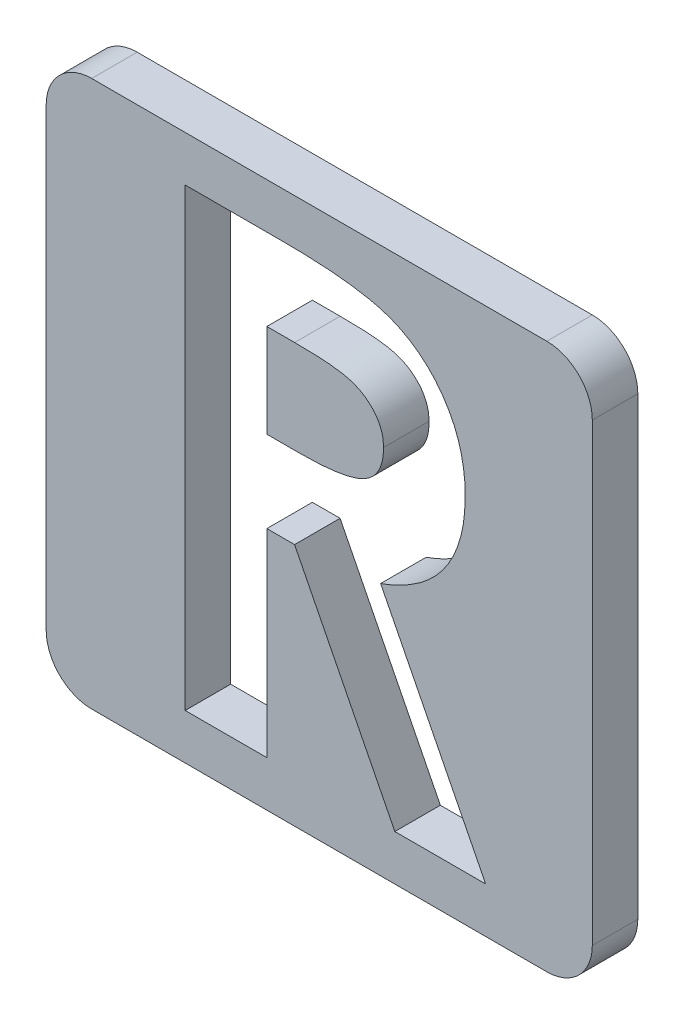
ISO-10303-21;
HEADER;
FILE_DESCRIPTION(('STEP AP214'),'2;1');
FILE_NAME('part.step','',(''),(''),'','','');
FILE_SCHEMA(('AUTOMOTIVE_DESIGN { 1 0 10303 214 1 1 1 1 }'));
ENDSEC;
DATA;
#1=APPLICATION_CONTEXT('core data for automotive mechanical design processes');
#2=APPLICATION_PROTOCOL_DEFINITION('international standard','automotive_design',2000,#1);
#3=PRODUCT_CONTEXT('',#1,'mechanical');
#4=PRODUCT('Part','Part','',(#3));
#5=PRODUCT_RELATED_PRODUCT_CATEGORY('part','',(#4));
#6=PRODUCT_DEFINITION_FORMATION('','',#4);
#7=PRODUCT_DEFINITION_CONTEXT('part definition',#1,'design');
#8=PRODUCT_DEFINITION('design','',#6,#7);
#9=PRODUCT_DEFINITION_SHAPE('','',#8);
#10=(LENGTH_UNIT() NAMED_UNIT(*) SI_UNIT(.MILLI.,.METRE.));
#11=(NAMED_UNIT(*) PLANE_ANGLE_UNIT() SI_UNIT($,.RADIAN.));
#12=(NAMED_UNIT(*) SI_UNIT($,.STERADIAN.) SOLID_ANGLE_UNIT());
#13=UNCERTAINTY_MEASURE_WITH_UNIT(LENGTH_MEASURE(1.E-05),#10,'distance_accuracy_value','');
#14=(GEOMETRIC_REPRESENTATION_CONTEXT(3) GLOBAL_UNCERTAINTY_ASSIGNED_CONTEXT((#13)) GLOBAL_UNIT_ASSIGNED_CONTEXT((#10,
#11,#12)) REPRESENTATION_CONTEXT('',''));
#15=CARTESIAN_POINT('',(0.,0.,0.));
#16=DIRECTION('',(0.,0.,1.));
#17=DIRECTION('',(1.,0.,0.));
#18=AXIS2_PLACEMENT_3D('',#15,#16,#17);
#19=CARTESIAN_POINT('',(50.,50.,10.));
#20=DIRECTION('',(0.,0.,-1.));
#21=DIRECTION('',(-1.,0.,0.));
#22=AXIS2_PLACEMENT_3D('',#19,#20,#21);
#23=PLANE('',#22);
#24=DIRECTION('',(1.,0.,0.));
#25=VECTOR('',#24,1.);
#26=CARTESIAN_POINT('',(-49.9999999999999,60.,10.));
#27=LINE('',#26,#25);
#28=CARTESIAN_POINT('',(-49.9999999999999,60.,10.));
#29=VERTEX_POINT('',#28);
#30=CARTESIAN_POINT('',(49.9999999999999,60.,10.));
#31=VERTEX_POINT('',#30);
#32=EDGE_CURVE('E288',#29,#31,#27,.T.);
#33=ORIENTED_EDGE('',*,*,#32,.F.);
#34=CARTESIAN_POINT('',(-50.,50.,10.));
#35=DIRECTION('',(0.,0.,1.));
#36=DIRECTION('',(1.,0.,0.));
#37=AXIS2_PLACEMENT_3D('',#34,#35,#36);
#38=CIRCLE('',#37,10.);
#39=CARTESIAN_POINT('',(-60.,49.9999999999999,10.));
#40=VERTEX_POINT('',#39);
#41=EDGE_CURVE('E377',#29,#40,#38,.T.);
#42=ORIENTED_EDGE('',*,*,#41,.T.);
#43=DIRECTION('',(0.,-1.,0.));
#44=VECTOR('',#43,1.);
#45=CARTESIAN_POINT('',(-60.,49.9999999999999,10.));
#46=LINE('',#45,#44);
#47=CARTESIAN_POINT('',(-60.,-49.9999999999999,10.));
#48=VERTEX_POINT('',#47);
#49=EDGE_CURVE('E379',#40,#48,#46,.T.);
#50=ORIENTED_EDGE('',*,*,#49,.T.);
#51=CARTESIAN_POINT('',(-50.,-50.,10.));
#52=DIRECTION('',(0.,0.,1.));
#53=DIRECTION('',(1.,0.,0.));
#54=AXIS2_PLACEMENT_3D('',#51,#52,#53);
#55=CIRCLE('',#54,10.);
#56=CARTESIAN_POINT('',(-49.9999999999999,-60.,10.));
#57=VERTEX_POINT('',#56);
#58=EDGE_CURVE('E381',#48,#57,#55,.T.);
#59=ORIENTED_EDGE('',*,*,#58,.T.);
#60=DIRECTION('',(1.,0.,0.));
#61=VECTOR('',#60,1.);
#62=CARTESIAN_POINT('',(-49.9999999999999,-60.,10.));
#63=LINE('',#62,#61);
#64=CARTESIAN_POINT('',(49.9999999999999,-60.,10.));
#65=VERTEX_POINT('',#64);
#66=EDGE_CURVE('E383',#57,#65,#63,.T.);
#67=ORIENTED_EDGE('',*,*,#66,.T.);
#68=CARTESIAN_POINT('',(50.,-50.,10.));
#69=DIRECTION('',(0.,0.,1.));
#70=DIRECTION('',(1.,0.,0.));
#71=AXIS2_PLACEMENT_3D('',#68,#69,#70);
#72=CIRCLE('',#71,10.);
#73=CARTESIAN_POINT('',(60.,-50.,10.));
#74=VERTEX_POINT('',#73);
#75=EDGE_CURVE('E209',#65,#74,#72,.T.);
#76=ORIENTED_EDGE('',*,*,#75,.T.);
#77=DIRECTION('',(0.,-1.,0.));
#78=VECTOR('',#77,1.);
#79=CARTESIAN_POINT('',(60.,49.9999999999999,10.));
#80=LINE('',#79,#78);
#81=CARTESIAN_POINT('',(60.,49.9999999999999,10.));
#82=VERTEX_POINT('',#81);
#83=EDGE_CURVE('E386',#82,#74,#80,.T.);
#84=ORIENTED_EDGE('',*,*,#83,.F.);
#85=CARTESIAN_POINT('',(50.,50.,10.));
#86=DIRECTION('',(0.,0.,-1.));
#87=DIRECTION('',(-1.,0.,0.));
#88=AXIS2_PLACEMENT_3D('',#85,#86,#87);
#89=CIRCLE('',#88,10.);
#90=EDGE_CURVE('E388',#31,#82,#89,.T.);
#91=ORIENTED_EDGE('',*,*,#90,.F.);
#92=EDGE_LOOP('',(#33,#42,#50,#59,#67,#76,#84,#91));
#93=FACE_BOUND('',#92,.T.);
#94=DIRECTION('',(0.,1.,0.));
#95=VECTOR('',#94,1.);
#96=CARTESIAN_POINT('',(-29.4615384615385,-50.,10.));
#97=LINE('',#96,#95);
#98=CARTESIAN_POINT('',(-29.4615384615385,-50.,10.));
#99=VERTEX_POINT('',#98);
#100=CARTESIAN_POINT('',(-29.4615384615385,50.,10.));
#101=VERTEX_POINT('',#100);
#102=EDGE_CURVE('E111',#99,#101,#97,.T.);
#103=ORIENTED_EDGE('',*,*,#102,.T.);
#104=DIRECTION('',(1.,0.,0.));
#105=VECTOR('',#104,1.);
#106=CARTESIAN_POINT('',(-29.4615384615385,50.,10.));
#107=LINE('',#106,#105);
#108=CARTESIAN_POINT('',(-8.54807692307692,50.,10.));
#109=VERTEX_POINT('',#108);
#110=EDGE_CURVE('E101',#101,#109,#107,.T.);
#111=ORIENTED_EDGE('',*,*,#110,.T.);
#112=CARTESIAN_POINT('',(-8.54807692307692,50.,10.));
#113=CARTESIAN_POINT('',(-7.16570348136394,49.9950933676502,10.));
#114=CARTESIAN_POINT('',(-4.507009958922,49.9856565315163,10.));
#115=CARTESIAN_POINT('',(-0.673319114981953,49.836768254122,10.));
#116=CARTESIAN_POINT('',(2.84845314370072,49.6295779958576,10.));
#117=CARTESIAN_POINT('',(6.06352111950216,49.3134001625521,10.));
#118=CARTESIAN_POINT('',(8.97050935335562,48.8941865741159,10.));
#119=CARTESIAN_POINT('',(11.5723313269203,48.4000031240224,10.));
#120=CARTESIAN_POINT('',(13.8689109915062,47.8367751326788,10.));
#121=CARTESIAN_POINT('',(15.8796168248235,47.1349486181643,10.));
#122=CARTESIAN_POINT('',(17.6941794119808,46.3432989500912,10.));
#123=CARTESIAN_POINT('',(19.3856040157519,45.4336789652992,10.));
#124=CARTESIAN_POINT('',(20.9912059781231,44.4162175699911,10.));
#125=CARTESIAN_POINT('',(22.5002535840768,43.2641426007948,10.));
#126=CARTESIAN_POINT('',(23.9258608121027,41.9981796025808,10.));
#127=CARTESIAN_POINT('',(25.2707171557078,40.6170542592858,10.));
#128=CARTESIAN_POINT('',(26.5158185482425,39.10905519684,10.));
#129=CARTESIAN_POINT('',(27.6534552713426,37.4837110556326,10.));
#130=CARTESIAN_POINT('',(28.6903195706035,35.7738862904611,10.));
#131=CARTESIAN_POINT('',(29.6066901433412,33.9772333007643,10.));
#132=CARTESIAN_POINT('',(30.3518842161974,32.0925026340516,10.));
#133=CARTESIAN_POINT('',(31.0103430625997,30.1469327231469,10.));
#134=CARTESIAN_POINT('',(31.4846096378619,28.112711264479,10.));
#135=CARTESIAN_POINT('',(31.8144551030385,26.0096417473334,10.));
#136=CARTESIAN_POINT('',(32.0559550490669,23.8303211437208,10.));
#137=CARTESIAN_POINT('',(32.0698401414022,22.3497874863529,10.));
#138=CARTESIAN_POINT('',(32.0769230769231,21.5945512820513,10.));
#139=B_SPLINE_CURVE_WITH_KNOTS('',3,(#112,#113,#114,#115,#116,#117,#118,#119,#120,#121,#122,
#123,#124,#125,#126,#127,#128,#129,#130,#131,#132,#133,#134,#135,#136,#137,#138),.UNSPECIFIED.,
.F.,.F.,(4,1,1,1,1,1,1,1,1,1,1,1,1,1,1,1,1,1,1,1,1,1,1,1,4),(0.,0.0728890266200383,
0.140186129944494,0.202277434124959,0.258895131751463,0.310482942465478,0.357095244131335,
0.398513566653466,0.435037510870116,0.469251485829287,0.502805027890275,0.536210446318562,
0.569379359939206,0.602801475048393,0.636665798336777,0.670928656894043,0.705803000229313,
0.741189061245877,0.776304311076462,0.812004300912935,0.847968975808895,0.884521761196479,
0.921974158544205,0.960198175809608,1.),.UNSPECIFIED.);
#140=CARTESIAN_POINT('',(32.0769230769231,21.5945512820513,10.));
#141=VERTEX_POINT('',#140);
#142=EDGE_CURVE('E180',#109,#141,#139,.T.);
#143=ORIENTED_EDGE('',*,*,#142,.T.);
#144=CARTESIAN_POINT('',(32.0769230769231,21.5945512820513,10.));
#145=CARTESIAN_POINT('',(32.0585241575579,20.8062581795036,10.));
#146=CARTESIAN_POINT('',(32.0224472300487,19.2605590788025,10.));
#147=CARTESIAN_POINT('',(31.828117271832,16.9900531664223,10.));
#148=CARTESIAN_POINT('',(31.4729431533373,14.8177919244886,10.));
#149=CARTESIAN_POINT('',(30.934980279809,12.7501354666698,10.));
#150=CARTESIAN_POINT('',(30.316661831982,10.7613493978477,10.));
#151=CARTESIAN_POINT('',(29.4944569039569,8.88812806461248,10.));
#152=CARTESIAN_POINT('',(28.5665173787216,7.1032281764701,10.));
#153=CARTESIAN_POINT('',(27.4644307161339,5.43189781885025,10.));
#154=CARTESIAN_POINT('',(26.2549444445558,3.83701340535703,10.));
#155=CARTESIAN_POINT('',(24.8483373529539,2.37968087459511,10.));
#156=CARTESIAN_POINT('',(23.3357359747616,0.981574121063749,10.));
#157=CARTESIAN_POINT('',(21.6321114777145,-0.269734191523331,10.));
#158=CARTESIAN_POINT('',(19.8125612121984,-1.45885300961546,10.));
#159=CARTESIAN_POINT('',(17.8409326288097,-2.53651133321237,10.));
#160=CARTESIAN_POINT('',(15.7300932518639,-3.52979901121726,10.));
#161=CARTESIAN_POINT('',(14.2460686345266,-4.08372483334129,10.));
#162=CARTESIAN_POINT('',(13.4871794871795,-4.36698717948719,10.));
#163=B_SPLINE_CURVE_WITH_KNOTS('',3,(#144,#145,#146,#147,#148,#149,#150,#151,#152,#153,#154,
#155,#156,#157,#158,#159,#160,#161,#162),.UNSPECIFIED.,.F.,.F.,(4,1,1,1,1,1,1,1,1,1,1,1,1,1,1,1,
4),(0.,0.0687412630793655,0.134789088195034,0.198536049560691,0.260385650605921,
0.320961578232197,0.379903849584149,0.438502935775268,0.496154343976269,0.554265483208499,
0.612748760815695,0.672513442526179,0.733646401897974,0.796789619481454,0.861935699041025,
0.929397734774898,1.),.UNSPECIFIED.);
#164=CARTESIAN_POINT('',(13.4871794871795,-4.36698717948719,10.));
#165=VERTEX_POINT('',#164);
#166=EDGE_CURVE('E188',#141,#165,#163,.T.);
#167=ORIENTED_EDGE('',*,*,#166,.T.);
#168=DIRECTION('',(0.451283039143577,-0.892380870806483,0.));
#169=VECTOR('',#168,1.);
#170=CARTESIAN_POINT('',(13.4871794871795,-4.36698717948719,10.));
#171=LINE('',#170,#169);
#172=CARTESIAN_POINT('',(36.5641025641026,-50.,10.));
#173=VERTEX_POINT('',#172);
#174=EDGE_CURVE('E195',#165,#173,#171,.T.);
#175=ORIENTED_EDGE('',*,*,#174,.T.);
#176=DIRECTION('',(-1.,0.,0.));
#177=VECTOR('',#176,1.);
#178=CARTESIAN_POINT('',(36.5641025641026,-50.,10.));
#179=LINE('',#178,#177);
#180=CARTESIAN_POINT('',(16.6121794871795,-50.,10.));
#181=VERTEX_POINT('',#180);
#182=EDGE_CURVE('E309',#173,#181,#179,.T.);
#183=ORIENTED_EDGE('',*,*,#182,.T.);
#184=DIRECTION('',(-0.451146541398825,0.892449885530766,0.));
#185=VECTOR('',#184,1.);
#186=CARTESIAN_POINT('',(16.6121794871795,-50.,10.));
#187=LINE('',#186,#185);
#188=CARTESIAN_POINT('',(-5.42307692307693,-6.41025641025642,10.));
#189=VERTEX_POINT('',#188);
#190=EDGE_CURVE('E306',#181,#189,#187,.T.);
#191=ORIENTED_EDGE('',*,*,#190,.T.);
#192=DIRECTION('',(-1.,0.,0.));
#193=VECTOR('',#192,1.);
#194=CARTESIAN_POINT('',(-5.42307692307693,-6.41025641025642,10.));
#195=LINE('',#194,#193);
#196=CARTESIAN_POINT('',(-11.5128205128205,-6.41025641025642,10.));
#197=VERTEX_POINT('',#196);
#198=EDGE_CURVE('E303',#189,#197,#195,.T.);
#199=ORIENTED_EDGE('',*,*,#198,.T.);
#200=DIRECTION('',(0.,-1.,0.));
#201=VECTOR('',#200,1.);
#202=CARTESIAN_POINT('',(-11.5128205128205,-6.41025641025642,10.));
#203=LINE('',#202,#201);
#204=CARTESIAN_POINT('',(-11.5128205128205,-50.,10.));
#205=VERTEX_POINT('',#204);
#206=EDGE_CURVE('E300',#197,#205,#203,.T.);
#207=ORIENTED_EDGE('',*,*,#206,.T.);
#208=DIRECTION('',(-1.,0.,0.));
#209=VECTOR('',#208,1.);
#210=CARTESIAN_POINT('',(-11.5128205128205,-50.,10.));
#211=LINE('',#210,#209);
#212=EDGE_CURVE('E297',#205,#99,#211,.T.);
#213=ORIENTED_EDGE('',*,*,#212,.T.);
#214=EDGE_LOOP('',(#103,#111,#143,#167,#175,#183,#191,#199,#207,#213));
#215=FACE_BOUND('',#214,.T.);
#216=ADVANCED_FACE('F43',(#93,#215),#23,.F.);
#217=CARTESIAN_POINT('',(50.,50.,0.));
#218=DIRECTION('',(0.,0.,-1.));
#219=DIRECTION('',(-1.,0.,0.));
#220=AXIS2_PLACEMENT_3D('',#217,#218,#219);
#221=PLANE('',#220);
#222=DIRECTION('',(1.,0.,0.));
#223=VECTOR('',#222,1.);
#224=CARTESIAN_POINT('',(-49.9999999999999,60.,0.));
#225=LINE('',#224,#223);
#226=CARTESIAN_POINT('',(-49.9999999999999,60.,0.));
#227=VERTEX_POINT('',#226);
#228=CARTESIAN_POINT('',(49.9999999999999,60.,0.));
#229=VERTEX_POINT('',#228);
#230=EDGE_CURVE('E281',#227,#229,#225,.T.);
#231=ORIENTED_EDGE('',*,*,#230,.T.);
#232=CARTESIAN_POINT('',(50.,50.,0.));
#233=DIRECTION('',(0.,0.,-1.));
#234=DIRECTION('',(-1.,0.,0.));
#235=AXIS2_PLACEMENT_3D('',#232,#233,#234);
#236=CIRCLE('',#235,10.);
#237=CARTESIAN_POINT('',(60.,49.9999999999999,0.));
#238=VERTEX_POINT('',#237);
#239=EDGE_CURVE('E370',#229,#238,#236,.T.);
#240=ORIENTED_EDGE('',*,*,#239,.T.);
#241=DIRECTION('',(0.,-1.,0.));
#242=VECTOR('',#241,1.);
#243=CARTESIAN_POINT('',(60.,49.9999999999999,0.));
#244=LINE('',#243,#242);
#245=CARTESIAN_POINT('',(60.,-50.,0.));
#246=VERTEX_POINT('',#245);
#247=EDGE_CURVE('E363',#238,#246,#244,.T.);
#248=ORIENTED_EDGE('',*,*,#247,.T.);
#249=CARTESIAN_POINT('',(50.,-50.,0.));
#250=DIRECTION('',(0.,0.,1.));
#251=DIRECTION('',(1.,0.,0.));
#252=AXIS2_PLACEMENT_3D('',#249,#250,#251);
#253=CIRCLE('',#252,10.);
#254=CARTESIAN_POINT('',(49.9999999999999,-60.,0.));
#255=VERTEX_POINT('',#254);
#256=EDGE_CURVE('E397',#255,#246,#253,.T.);
#257=ORIENTED_EDGE('',*,*,#256,.F.);
#258=DIRECTION('',(1.,0.,0.));
#259=VECTOR('',#258,1.);
#260=CARTESIAN_POINT('',(-49.9999999999999,-60.,0.));
#261=LINE('',#260,#259);
#262=CARTESIAN_POINT('',(-49.9999999999999,-60.,0.));
#263=VERTEX_POINT('',#262);
#264=EDGE_CURVE('E401',#263,#255,#261,.T.);
#265=ORIENTED_EDGE('',*,*,#264,.F.);
#266=CARTESIAN_POINT('',(-50.,-50.,0.));
#267=DIRECTION('',(0.,0.,1.));
#268=DIRECTION('',(1.,0.,0.));
#269=AXIS2_PLACEMENT_3D('',#266,#267,#268);
#270=CIRCLE('',#269,10.);
#271=CARTESIAN_POINT('',(-60.,-49.9999999999999,0.));
#272=VERTEX_POINT('',#271);
#273=EDGE_CURVE('E405',#272,#263,#270,.T.);
#274=ORIENTED_EDGE('',*,*,#273,.F.);
#275=DIRECTION('',(0.,-1.,0.));
#276=VECTOR('',#275,1.);
#277=CARTESIAN_POINT('',(-60.,49.9999999999999,0.));
#278=LINE('',#277,#276);
#279=CARTESIAN_POINT('',(-60.,49.9999999999999,0.));
#280=VERTEX_POINT('',#279);
#281=EDGE_CURVE('E409',#280,#272,#278,.T.);
#282=ORIENTED_EDGE('',*,*,#281,.F.);
#283=CARTESIAN_POINT('',(-50.,50.,0.));
#284=DIRECTION('',(0.,0.,1.));
#285=DIRECTION('',(1.,0.,0.));
#286=AXIS2_PLACEMENT_3D('',#283,#284,#285);
#287=CIRCLE('',#286,10.);
#288=EDGE_CURVE('E412',#227,#280,#287,.T.);
#289=ORIENTED_EDGE('',*,*,#288,.F.);
#290=EDGE_LOOP('',(#231,#240,#248,#257,#265,#274,#282,#289));
#291=FACE_BOUND('',#290,.T.);
#292=DIRECTION('',(1.,0.,0.));
#293=VECTOR('',#292,1.);
#294=CARTESIAN_POINT('',(-29.4615384615385,50.,0.));
#295=LINE('',#294,#293);
#296=CARTESIAN_POINT('',(-29.4615384615385,50.,0.));
#297=VERTEX_POINT('',#296);
#298=CARTESIAN_POINT('',(-8.54807692307692,50.,0.));
#299=VERTEX_POINT('',#298);
#300=EDGE_CURVE('E97',#297,#299,#295,.T.);
#301=ORIENTED_EDGE('',*,*,#300,.F.);
#302=DIRECTION('',(0.,1.,0.));
#303=VECTOR('',#302,1.);
#304=CARTESIAN_POINT('',(-29.4615384615385,-50.,0.));
#305=LINE('',#304,#303);
#306=CARTESIAN_POINT('',(-29.4615384615385,-50.,0.));
#307=VERTEX_POINT('',#306);
#308=EDGE_CURVE('E46',#307,#297,#305,.T.);
#309=ORIENTED_EDGE('',*,*,#308,.F.);
#310=DIRECTION('',(-1.,0.,0.));
#311=VECTOR('',#310,1.);
#312=CARTESIAN_POINT('',(-11.5128205128205,-50.,0.));
#313=LINE('',#312,#311);
#314=CARTESIAN_POINT('',(-11.5128205128205,-50.,0.));
#315=VERTEX_POINT('',#314);
#316=EDGE_CURVE('E52',#315,#307,#313,.T.);
#317=ORIENTED_EDGE('',*,*,#316,.F.);
#318=DIRECTION('',(0.,-1.,0.));
#319=VECTOR('',#318,1.);
#320=CARTESIAN_POINT('',(-11.5128205128205,-6.41025641025642,0.));
#321=LINE('',#320,#319);
#322=CARTESIAN_POINT('',(-11.5128205128205,-6.41025641025642,0.));
#323=VERTEX_POINT('',#322);
#324=EDGE_CURVE('E212',#323,#315,#321,.T.);
#325=ORIENTED_EDGE('',*,*,#324,.F.);
#326=DIRECTION('',(-1.,0.,0.));
#327=VECTOR('',#326,1.);
#328=CARTESIAN_POINT('',(-5.42307692307693,-6.41025641025642,0.));
#329=LINE('',#328,#327);
#330=CARTESIAN_POINT('',(-5.42307692307693,-6.41025641025642,0.));
#331=VERTEX_POINT('',#330);
#332=EDGE_CURVE('E216',#331,#323,#329,.T.);
#333=ORIENTED_EDGE('',*,*,#332,.F.);
#334=DIRECTION('',(-0.451146541398825,0.892449885530766,0.));
#335=VECTOR('',#334,1.);
#336=CARTESIAN_POINT('',(16.6121794871795,-50.,0.));
#337=LINE('',#336,#335);
#338=CARTESIAN_POINT('',(16.6121794871795,-50.,0.));
#339=VERTEX_POINT('',#338);
#340=EDGE_CURVE('E219',#339,#331,#337,.T.);
#341=ORIENTED_EDGE('',*,*,#340,.F.);
#342=DIRECTION('',(-1.,0.,0.));
#343=VECTOR('',#342,1.);
#344=CARTESIAN_POINT('',(36.5641025641026,-50.,0.));
#345=LINE('',#344,#343);
#346=CARTESIAN_POINT('',(36.5641025641026,-50.,0.));
#347=VERTEX_POINT('',#346);
#348=EDGE_CURVE('E222',#347,#339,#345,.T.);
#349=ORIENTED_EDGE('',*,*,#348,.F.);
#350=DIRECTION('',(0.451283039143577,-0.892380870806483,0.));
#351=VECTOR('',#350,1.);
#352=CARTESIAN_POINT('',(13.4871794871795,-4.36698717948719,0.));
#353=LINE('',#352,#351);
#354=CARTESIAN_POINT('',(13.4871794871795,-4.36698717948719,0.));
#355=VERTEX_POINT('',#354);
#356=EDGE_CURVE('E225',#355,#347,#353,.T.);
#357=ORIENTED_EDGE('',*,*,#356,.F.);
#358=CARTESIAN_POINT('',(32.0769230769231,21.5945512820513,0.));
#359=CARTESIAN_POINT('',(32.0585241575579,20.8062581795036,0.));
#360=CARTESIAN_POINT('',(32.0224472300487,19.2605590788025,0.));
#361=CARTESIAN_POINT('',(31.828117271832,16.9900531664223,0.));
#362=CARTESIAN_POINT('',(31.4729431533373,14.8177919244886,0.));
#363=CARTESIAN_POINT('',(30.934980279809,12.7501354666698,0.));
#364=CARTESIAN_POINT('',(30.316661831982,10.7613493978477,0.));
#365=CARTESIAN_POINT('',(29.4944569039569,8.88812806461248,0.));
#366=CARTESIAN_POINT('',(28.5665173787216,7.1032281764701,0.));
#367=CARTESIAN_POINT('',(27.4644307161339,5.43189781885025,0.));
#368=CARTESIAN_POINT('',(26.2549444445558,3.83701340535703,0.));
#369=CARTESIAN_POINT('',(24.8483373529539,2.37968087459511,0.));
#370=CARTESIAN_POINT('',(23.3357359747616,0.981574121063749,0.));
#371=CARTESIAN_POINT('',(21.6321114777145,-0.269734191523331,0.));
#372=CARTESIAN_POINT('',(19.8125612121984,-1.45885300961546,0.));
#373=CARTESIAN_POINT('',(17.8409326288097,-2.53651133321237,0.));
#374=CARTESIAN_POINT('',(15.7300932518639,-3.52979901121726,0.));
#375=CARTESIAN_POINT('',(14.2460686345266,-4.08372483334129,0.));
#376=CARTESIAN_POINT('',(13.4871794871795,-4.36698717948719,0.));
#377=B_SPLINE_CURVE_WITH_KNOTS('',3,(#358,#359,#360,#361,#362,#363,#364,#365,#366,#367,#368,
#369,#370,#371,#372,#373,#374,#375,#376),.UNSPECIFIED.,.F.,.F.,(4,1,1,1,1,1,1,1,1,1,1,1,1,1,1,1,
4),(0.,0.0687412630793655,0.134789088195034,0.198536049560691,0.260385650605921,
0.320961578232197,0.379903849584149,0.438502935775268,0.496154343976269,0.554265483208499,
0.612748760815695,0.672513442526179,0.733646401897974,0.796789619481454,0.861935699041025,
0.929397734774898,1.),.UNSPECIFIED.);
#378=CARTESIAN_POINT('',(32.0769230769231,21.5945512820513,0.));
#379=VERTEX_POINT('',#378);
#380=EDGE_CURVE('E185',#379,#355,#377,.T.);
#381=ORIENTED_EDGE('',*,*,#380,.F.);
#382=CARTESIAN_POINT('',(-8.54807692307692,50.,0.));
#383=CARTESIAN_POINT('',(-7.16570348136394,49.9950933676502,0.));
#384=CARTESIAN_POINT('',(-4.507009958922,49.9856565315163,0.));
#385=CARTESIAN_POINT('',(-0.673319114981953,49.836768254122,0.));
#386=CARTESIAN_POINT('',(2.84845314370072,49.6295779958576,0.));
#387=CARTESIAN_POINT('',(6.06352111950216,49.3134001625521,0.));
#388=CARTESIAN_POINT('',(8.97050935335562,48.8941865741159,0.));
#389=CARTESIAN_POINT('',(11.5723313269203,48.4000031240224,0.));
#390=CARTESIAN_POINT('',(13.8689109915062,47.8367751326788,0.));
#391=CARTESIAN_POINT('',(15.8796168248235,47.1349486181643,0.));
#392=CARTESIAN_POINT('',(17.6941794119808,46.3432989500912,0.));
#393=CARTESIAN_POINT('',(19.3856040157519,45.4336789652992,0.));
#394=CARTESIAN_POINT('',(20.9912059781231,44.4162175699911,0.));
#395=CARTESIAN_POINT('',(22.5002535840768,43.2641426007948,0.));
#396=CARTESIAN_POINT('',(23.9258608121027,41.9981796025808,0.));
#397=CARTESIAN_POINT('',(25.2707171557078,40.6170542592858,0.));
#398=CARTESIAN_POINT('',(26.5158185482425,39.10905519684,0.));
#399=CARTESIAN_POINT('',(27.6534552713426,37.4837110556326,0.));
#400=CARTESIAN_POINT('',(28.6903195706035,35.7738862904611,0.));
#401=CARTESIAN_POINT('',(29.6066901433412,33.9772333007643,0.));
#402=CARTESIAN_POINT('',(30.3518842161974,32.0925026340516,0.));
#403=CARTESIAN_POINT('',(31.0103430625997,30.1469327231469,0.));
#404=CARTESIAN_POINT('',(31.4846096378619,28.112711264479,0.));
#405=CARTESIAN_POINT('',(31.8144551030385,26.0096417473334,0.));
#406=CARTESIAN_POINT('',(32.0559550490669,23.8303211437208,0.));
#407=CARTESIAN_POINT('',(32.0698401414022,22.3497874863529,0.));
#408=CARTESIAN_POINT('',(32.0769230769231,21.5945512820513,0.));
#409=B_SPLINE_CURVE_WITH_KNOTS('',3,(#382,#383,#384,#385,#386,#387,#388,#389,#390,#391,#392,
#393,#394,#395,#396,#397,#398,#399,#400,#401,#402,#403,#404,#405,#406,#407,#408),.UNSPECIFIED.,
.F.,.F.,(4,1,1,1,1,1,1,1,1,1,1,1,1,1,1,1,1,1,1,1,1,1,1,1,4),(0.,0.0728890266200383,
0.140186129944494,0.202277434124959,0.258895131751463,0.310482942465478,0.357095244131335,
0.398513566653466,0.435037510870116,0.469251485829287,0.502805027890275,0.536210446318562,
0.569379359939206,0.602801475048393,0.636665798336777,0.670928656894043,0.705803000229313,
0.741189061245877,0.776304311076462,0.812004300912935,0.847968975808895,0.884521761196479,
0.921974158544205,0.960198175809608,1.),.UNSPECIFIED.);
#410=EDGE_CURVE('E182',#299,#379,#409,.T.);
#411=ORIENTED_EDGE('',*,*,#410,.F.);
#412=EDGE_LOOP('',(#301,#309,#317,#325,#333,#341,#349,#357,#381,#411));
#413=FACE_BOUND('',#412,.T.);
#414=ADVANCED_FACE('F264',(#291,#413),#221,.T.);
#415=CARTESIAN_POINT('',(-49.9999999999999,60.,10.));
#416=DIRECTION('',(0.,1.,0.));
#417=DIRECTION('',(0.,0.,1.));
#418=AXIS2_PLACEMENT_3D('',#415,#416,#417);
#419=PLANE('',#418);
#420=ORIENTED_EDGE('',*,*,#230,.F.);
#421=DIRECTION('',(0.,0.,-1.));
#422=VECTOR('',#421,1.);
#423=CARTESIAN_POINT('',(-49.9999999999999,60.,10.));
#424=LINE('',#423,#422);
#425=EDGE_CURVE('E410',#29,#227,#424,.T.);
#426=ORIENTED_EDGE('',*,*,#425,.F.);
#427=ORIENTED_EDGE('',*,*,#32,.T.);
#428=DIRECTION('',(0.,0.,-1.));
#429=VECTOR('',#428,1.);
#430=CARTESIAN_POINT('',(49.9999999999999,60.,10.));
#431=LINE('',#430,#429);
#432=EDGE_CURVE('E414',#31,#229,#431,.T.);
#433=ORIENTED_EDGE('',*,*,#432,.T.);
#434=EDGE_LOOP('',(#420,#426,#427,#433));
#435=FACE_BOUND('',#434,.T.);
#436=ADVANCED_FACE('F266',(#435),#419,.T.);
#437=CARTESIAN_POINT('',(-50.,50.,10.));
#438=DIRECTION('',(0.,0.,-1.));
#439=DIRECTION('',(-1.,0.,0.));
#440=AXIS2_PLACEMENT_3D('',#437,#438,#439);
#441=CYLINDRICAL_SURFACE('',#440,10.);
#442=ORIENTED_EDGE('',*,*,#288,.T.);
#443=DIRECTION('',(0.,0.,-1.));
#444=VECTOR('',#443,1.);
#445=CARTESIAN_POINT('',(-60.,49.9999999999999,10.));
#446=LINE('',#445,#444);
#447=EDGE_CURVE('E406',#40,#280,#446,.T.);
#448=ORIENTED_EDGE('',*,*,#447,.F.);
#449=ORIENTED_EDGE('',*,*,#41,.F.);
#450=ORIENTED_EDGE('',*,*,#425,.T.);
#451=EDGE_LOOP('',(#442,#448,#449,#450));
#452=FACE_BOUND('',#451,.T.);
#453=ADVANCED_FACE('F272',(#452),#441,.T.);
#454=CARTESIAN_POINT('',(-60.,49.9999999999999,10.));
#455=DIRECTION('',(1.,0.,0.));
#456=DIRECTION('',(0.,1.,0.));
#457=AXIS2_PLACEMENT_3D('',#454,#455,#456);
#458=PLANE('',#457);
#459=ORIENTED_EDGE('',*,*,#281,.T.);
#460=DIRECTION('',(0.,0.,-1.));
#461=VECTOR('',#460,1.);
#462=CARTESIAN_POINT('',(-60.,-49.9999999999999,10.));
#463=LINE('',#462,#461);
#464=EDGE_CURVE('E402',#48,#272,#463,.T.);
#465=ORIENTED_EDGE('',*,*,#464,.F.);
#466=ORIENTED_EDGE('',*,*,#49,.F.);
#467=ORIENTED_EDGE('',*,*,#447,.T.);
#468=EDGE_LOOP('',(#459,#465,#466,#467));
#469=FACE_BOUND('',#468,.T.);
#470=ADVANCED_FACE('F340',(#469),#458,.F.);
#471=CARTESIAN_POINT('',(-50.,-50.,10.));
#472=DIRECTION('',(0.,0.,-1.));
#473=DIRECTION('',(-1.,0.,0.));
#474=AXIS2_PLACEMENT_3D('',#471,#472,#473);
#475=CYLINDRICAL_SURFACE('',#474,10.);
#476=ORIENTED_EDGE('',*,*,#273,.T.);
#477=DIRECTION('',(0.,0.,-1.));
#478=VECTOR('',#477,1.);
#479=CARTESIAN_POINT('',(-49.9999999999999,-60.,10.));
#480=LINE('',#479,#478);
#481=EDGE_CURVE('E398',#57,#263,#480,.T.);
#482=ORIENTED_EDGE('',*,*,#481,.F.);
#483=ORIENTED_EDGE('',*,*,#58,.F.);
#484=ORIENTED_EDGE('',*,*,#464,.T.);
#485=EDGE_LOOP('',(#476,#482,#483,#484));
#486=FACE_BOUND('',#485,.T.);
#487=ADVANCED_FACE('F344',(#486),#475,.T.);
#488=CARTESIAN_POINT('',(-49.9999999999999,-60.,10.));
#489=DIRECTION('',(0.,1.,0.));
#490=DIRECTION('',(0.,0.,1.));
#491=AXIS2_PLACEMENT_3D('',#488,#489,#490);
#492=PLANE('',#491);
#493=ORIENTED_EDGE('',*,*,#264,.T.);
#494=DIRECTION('',(0.,0.,-1.));
#495=VECTOR('',#494,1.);
#496=CARTESIAN_POINT('',(49.9999999999999,-60.,10.));
#497=LINE('',#496,#495);
#498=EDGE_CURVE('E387',#65,#255,#497,.T.);
#499=ORIENTED_EDGE('',*,*,#498,.F.);
#500=ORIENTED_EDGE('',*,*,#66,.F.);
#501=ORIENTED_EDGE('',*,*,#481,.T.);
#502=EDGE_LOOP('',(#493,#499,#500,#501));
#503=FACE_BOUND('',#502,.T.);
#504=ADVANCED_FACE('F348',(#503),#492,.F.);
#505=CARTESIAN_POINT('',(50.,-50.,10.));
#506=DIRECTION('',(0.,0.,-1.));
#507=DIRECTION('',(-1.,0.,0.));
#508=AXIS2_PLACEMENT_3D('',#505,#506,#507);
#509=CYLINDRICAL_SURFACE('',#508,10.);
#510=ORIENTED_EDGE('',*,*,#256,.T.);
#511=DIRECTION('',(0.,0.,-1.));
#512=VECTOR('',#511,1.);
#513=CARTESIAN_POINT('',(60.,-50.,10.));
#514=LINE('',#513,#512);
#515=EDGE_CURVE('E367',#74,#246,#514,.T.);
#516=ORIENTED_EDGE('',*,*,#515,.F.);
#517=ORIENTED_EDGE('',*,*,#75,.F.);
#518=ORIENTED_EDGE('',*,*,#498,.T.);
#519=EDGE_LOOP('',(#510,#516,#517,#518));
#520=FACE_BOUND('',#519,.T.);
#521=ADVANCED_FACE('F352',(#520),#509,.T.);
#522=CARTESIAN_POINT('',(60.,49.9999999999999,10.));
#523=DIRECTION('',(1.,0.,0.));
#524=DIRECTION('',(0.,1.,0.));
#525=AXIS2_PLACEMENT_3D('',#522,#523,#524);
#526=PLANE('',#525);
#527=ORIENTED_EDGE('',*,*,#247,.F.);
#528=DIRECTION('',(0.,0.,-1.));
#529=VECTOR('',#528,1.);
#530=CARTESIAN_POINT('',(60.,49.9999999999999,10.));
#531=LINE('',#530,#529);
#532=EDGE_CURVE('E286',#82,#238,#531,.T.);
#533=ORIENTED_EDGE('',*,*,#532,.F.);
#534=ORIENTED_EDGE('',*,*,#83,.T.);
#535=ORIENTED_EDGE('',*,*,#515,.T.);
#536=EDGE_LOOP('',(#527,#533,#534,#535));
#537=FACE_BOUND('',#536,.T.);
#538=ADVANCED_FACE('F334',(#537),#526,.T.);
#539=CARTESIAN_POINT('',(50.,50.,10.));
#540=DIRECTION('',(0.,0.,-1.));
#541=DIRECTION('',(-1.,0.,0.));
#542=AXIS2_PLACEMENT_3D('',#539,#540,#541);
#543=CYLINDRICAL_SURFACE('',#542,10.);
#544=ORIENTED_EDGE('',*,*,#239,.F.);
#545=ORIENTED_EDGE('',*,*,#432,.F.);
#546=ORIENTED_EDGE('',*,*,#90,.T.);
#547=ORIENTED_EDGE('',*,*,#532,.T.);
#548=EDGE_LOOP('',(#544,#545,#546,#547));
#549=FACE_BOUND('',#548,.T.);
#550=ADVANCED_FACE('F328',(#549),#543,.T.);
#551=CARTESIAN_POINT('',(-29.4615384615385,-50.,0.));
#552=DIRECTION('',(1.,0.,0.));
#553=DIRECTION('',(0.,0.,-1.));
#554=AXIS2_PLACEMENT_3D('',#551,#552,#553);
#555=PLANE('',#554);
#556=ORIENTED_EDGE('',*,*,#102,.F.);
#557=DIRECTION('',(0.,0.,1.));
#558=VECTOR('',#557,1.);
#559=CARTESIAN_POINT('',(-29.4615384615385,-50.,0.));
#560=LINE('',#559,#558);
#561=EDGE_CURVE('E12',#307,#99,#560,.T.);
#562=ORIENTED_EDGE('',*,*,#561,.F.);
#563=ORIENTED_EDGE('',*,*,#308,.T.);
#564=DIRECTION('',(0.,0.,1.));
#565=VECTOR('',#564,1.);
#566=CARTESIAN_POINT('',(-29.4615384615385,50.,0.));
#567=LINE('',#566,#565);
#568=EDGE_CURVE('E283',#297,#101,#567,.T.);
#569=ORIENTED_EDGE('',*,*,#568,.T.);
#570=EDGE_LOOP('',(#556,#562,#563,#569));
#571=FACE_BOUND('',#570,.T.);
#572=ADVANCED_FACE('F325',(#571),#555,.T.);
#573=CARTESIAN_POINT('',(-29.4615384615385,50.,0.));
#574=DIRECTION('',(0.,-1.,0.));
#575=DIRECTION('',(0.,0.,-1.));
#576=AXIS2_PLACEMENT_3D('',#573,#574,#575);
#577=PLANE('',#576);
#578=ORIENTED_EDGE('',*,*,#110,.F.);
#579=ORIENTED_EDGE('',*,*,#568,.F.);
#580=ORIENTED_EDGE('',*,*,#300,.T.);
#581=DIRECTION('',(0.,0.,1.));
#582=VECTOR('',#581,1.);
#583=CARTESIAN_POINT('',(-8.54807692307692,50.,0.));
#584=LINE('',#583,#582);
#585=EDGE_CURVE('E282',#299,#109,#584,.T.);
#586=ORIENTED_EDGE('',*,*,#585,.T.);
#587=EDGE_LOOP('',(#578,#579,#580,#586));
#588=FACE_BOUND('',#587,.T.);
#589=ADVANCED_FACE('F327',(#588),#577,.T.);
#590=DIRECTION('',(0.,0.,1.));
#591=VECTOR('',#590,1.);
#592=SURFACE_OF_LINEAR_EXTRUSION('',#409,#591);
#593=ORIENTED_EDGE('',*,*,#142,.F.);
#594=ORIENTED_EDGE('',*,*,#585,.F.);
#595=ORIENTED_EDGE('',*,*,#410,.T.);
#596=DIRECTION('',(0.,0.,1.));
#597=VECTOR('',#596,1.);
#598=CARTESIAN_POINT('',(32.0769230769231,21.5945512820513,0.));
#599=LINE('',#598,#597);
#600=EDGE_CURVE('E176',#379,#141,#599,.T.);
#601=ORIENTED_EDGE('',*,*,#600,.T.);
#602=EDGE_LOOP('',(#593,#594,#595,#601));
#603=FACE_BOUND('',#602,.T.);
#604=ADVANCED_FACE('F178',(#603),#592,.T.);
#605=DIRECTION('',(0.,0.,1.));
#606=VECTOR('',#605,1.);
#607=SURFACE_OF_LINEAR_EXTRUSION('',#377,#606);
#608=ORIENTED_EDGE('',*,*,#166,.F.);
#609=ORIENTED_EDGE('',*,*,#600,.F.);
#610=ORIENTED_EDGE('',*,*,#380,.T.);
#611=DIRECTION('',(0.,0.,1.));
#612=VECTOR('',#611,1.);
#613=CARTESIAN_POINT('',(13.4871794871795,-4.36698717948719,0.));
#614=LINE('',#613,#612);
#615=EDGE_CURVE('E191',#355,#165,#614,.T.);
#616=ORIENTED_EDGE('',*,*,#615,.T.);
#617=EDGE_LOOP('',(#608,#609,#610,#616));
#618=FACE_BOUND('',#617,.T.);
#619=ADVANCED_FACE('F189',(#618),#607,.T.);
#620=CARTESIAN_POINT('',(13.4871794871795,-4.36698717948719,0.));
#621=DIRECTION('',(-0.892380870806483,-0.451283039143577,0.));
#622=DIRECTION('',(0.451283039143577,-0.892380870806483,0.));
#623=AXIS2_PLACEMENT_3D('',#620,#621,#622);
#624=PLANE('',#623);
#625=ORIENTED_EDGE('',*,*,#174,.F.);
#626=ORIENTED_EDGE('',*,*,#615,.F.);
#627=ORIENTED_EDGE('',*,*,#356,.T.);
#628=DIRECTION('',(0.,0.,1.));
#629=VECTOR('',#628,1.);
#630=CARTESIAN_POINT('',(36.5641025641026,-50.,0.));
#631=LINE('',#630,#629);
#632=EDGE_CURVE('E224',#347,#173,#631,.T.);
#633=ORIENTED_EDGE('',*,*,#632,.T.);
#634=EDGE_LOOP('',(#625,#626,#627,#633));
#635=FACE_BOUND('',#634,.T.);
#636=ADVANCED_FACE('F241',(#635),#624,.T.);
#637=CARTESIAN_POINT('',(36.5641025641026,-50.,0.));
#638=DIRECTION('',(0.,1.,0.));
#639=DIRECTION('',(0.,0.,1.));
#640=AXIS2_PLACEMENT_3D('',#637,#638,#639);
#641=PLANE('',#640);
#642=ORIENTED_EDGE('',*,*,#182,.F.);
#643=ORIENTED_EDGE('',*,*,#632,.F.);
#644=ORIENTED_EDGE('',*,*,#348,.T.);
#645=DIRECTION('',(0.,0.,1.));
#646=VECTOR('',#645,1.);
#647=CARTESIAN_POINT('',(16.6121794871795,-50.,0.));
#648=LINE('',#647,#646);
#649=EDGE_CURVE('E221',#339,#181,#648,.T.);
#650=ORIENTED_EDGE('',*,*,#649,.T.);
#651=EDGE_LOOP('',(#642,#643,#644,#650));
#652=FACE_BOUND('',#651,.T.);
#653=ADVANCED_FACE('F245',(#652),#641,.T.);
#654=CARTESIAN_POINT('',(16.6121794871795,-50.,0.));
#655=DIRECTION('',(0.892449885530767,0.451146541398825,0.));
#656=DIRECTION('',(-0.451146541398825,0.892449885530767,0.));
#657=AXIS2_PLACEMENT_3D('',#654,#655,#656);
#658=PLANE('',#657);
#659=ORIENTED_EDGE('',*,*,#190,.F.);
#660=ORIENTED_EDGE('',*,*,#649,.F.);
#661=ORIENTED_EDGE('',*,*,#340,.T.);
#662=DIRECTION('',(0.,0.,1.));
#663=VECTOR('',#662,1.);
#664=CARTESIAN_POINT('',(-5.42307692307693,-6.41025641025642,0.));
#665=LINE('',#664,#663);
#666=EDGE_CURVE('E218',#331,#189,#665,.T.);
#667=ORIENTED_EDGE('',*,*,#666,.T.);
#668=EDGE_LOOP('',(#659,#660,#661,#667));
#669=FACE_BOUND('',#668,.T.);
#670=ADVANCED_FACE('F249',(#669),#658,.T.);
#671=CARTESIAN_POINT('',(-5.42307692307693,-6.41025641025642,0.));
#672=DIRECTION('',(0.,1.,0.));
#673=DIRECTION('',(0.,0.,1.));
#674=AXIS2_PLACEMENT_3D('',#671,#672,#673);
#675=PLANE('',#674);
#676=ORIENTED_EDGE('',*,*,#198,.F.);
#677=ORIENTED_EDGE('',*,*,#666,.F.);
#678=ORIENTED_EDGE('',*,*,#332,.T.);
#679=DIRECTION('',(0.,0.,1.));
#680=VECTOR('',#679,1.);
#681=CARTESIAN_POINT('',(-11.5128205128205,-6.41025641025642,0.));
#682=LINE('',#681,#680);
#683=EDGE_CURVE('E215',#323,#197,#682,.T.);
#684=ORIENTED_EDGE('',*,*,#683,.T.);
#685=EDGE_LOOP('',(#676,#677,#678,#684));
#686=FACE_BOUND('',#685,.T.);
#687=ADVANCED_FACE('F253',(#686),#675,.T.);
#688=CARTESIAN_POINT('',(-11.5128205128205,-6.41025641025642,0.));
#689=DIRECTION('',(-1.,0.,0.));
#690=DIRECTION('',(0.,0.,1.));
#691=AXIS2_PLACEMENT_3D('',#688,#689,#690);
#692=PLANE('',#691);
#693=ORIENTED_EDGE('',*,*,#206,.F.);
#694=ORIENTED_EDGE('',*,*,#683,.F.);
#695=ORIENTED_EDGE('',*,*,#324,.T.);
#696=DIRECTION('',(0.,0.,1.));
#697=VECTOR('',#696,1.);
#698=CARTESIAN_POINT('',(-11.5128205128205,-50.,0.));
#699=LINE('',#698,#697);
#700=EDGE_CURVE('E211',#315,#205,#699,.T.);
#701=ORIENTED_EDGE('',*,*,#700,.T.);
#702=EDGE_LOOP('',(#693,#694,#695,#701));
#703=FACE_BOUND('',#702,.T.);
#704=ADVANCED_FACE('F257',(#703),#692,.T.);
#705=CARTESIAN_POINT('',(-11.5128205128205,-50.,0.));
#706=DIRECTION('',(0.,1.,0.));
#707=DIRECTION('',(0.,0.,1.));
#708=AXIS2_PLACEMENT_3D('',#705,#706,#707);
#709=PLANE('',#708);
#710=ORIENTED_EDGE('',*,*,#212,.F.);
#711=ORIENTED_EDGE('',*,*,#700,.F.);
#712=ORIENTED_EDGE('',*,*,#316,.T.);
#713=ORIENTED_EDGE('',*,*,#561,.T.);
#714=EDGE_LOOP('',(#710,#711,#712,#713));
#715=FACE_BOUND('',#714,.T.);
#716=ADVANCED_FACE('F261',(#715),#709,.T.);
#717=CLOSED_SHELL('',(#216,#414,#436,#453,#470,#487,#504,#521,#538,#550,#572,#589,#604,#619,
#636,#653,#670,#687,#704,#716));
#718=MANIFOLD_SOLID_BREP('B2',#717);
#719=CARTESIAN_POINT('',(50.,50.,0.));
#720=DIRECTION('',(0.,0.,-1.));
#721=DIRECTION('',(-1.,0.,0.));
#722=AXIS2_PLACEMENT_3D('',#719,#720,#721);
#723=PLANE('',#722);
#724=DIRECTION('',(1.,0.,0.));
#725=VECTOR('',#724,1.);
#726=CARTESIAN_POINT('',(-11.5128205128205,11.5384615384615,0.));
#727=LINE('',#726,#725);
#728=CARTESIAN_POINT('',(-11.5128205128205,11.5384615384615,0.));
#729=VERTEX_POINT('',#728);
#730=CARTESIAN_POINT('',(-4.52163461538461,11.5384615384615,-2.07977850926601E-12));
#731=VERTEX_POINT('',#730);
#732=EDGE_CURVE('E618',#729,#731,#727,.T.);
#733=ORIENTED_EDGE('',*,*,#732,.F.);
#734=DIRECTION('',(0.,-1.,0.));
#735=VECTOR('',#734,1.);
#736=CARTESIAN_POINT('',(-11.5128205128205,32.0512820512821,0.));
#737=LINE('',#736,#735);
#738=CARTESIAN_POINT('',(-11.5128205128205,32.0512820512821,0.));
#739=VERTEX_POINT('',#738);
#740=EDGE_CURVE('E579',#739,#729,#737,.T.);
#741=ORIENTED_EDGE('',*,*,#740,.F.);
#742=DIRECTION('',(-1.,0.,0.));
#743=VECTOR('',#742,1.);
#744=CARTESIAN_POINT('',(-5.40304487179487,32.0512820512821,0.));
#745=LINE('',#744,#743);
#746=CARTESIAN_POINT('',(-5.40304487179487,32.0512820512821,0.));
#747=VERTEX_POINT('',#746);
#748=EDGE_CURVE('E621',#747,#739,#745,.T.);
#749=ORIENTED_EDGE('',*,*,#748,.F.);
#750=CARTESIAN_POINT('',(14.1282051282051,21.8349358974359,0.));
#751=CARTESIAN_POINT('',(14.1078465002032,22.36491050133,0.));
#752=CARTESIAN_POINT('',(14.067855748167,23.4059474006653,0.));
#753=CARTESIAN_POINT('',(13.6710232495203,24.9046755032661,0.));
#754=CARTESIAN_POINT('',(13.0393516299909,26.2918509029656,0.));
#755=CARTESIAN_POINT('',(12.1735028506129,27.5612059976709,0.));
#756=CARTESIAN_POINT('',(11.0830788805833,28.6740102996682,0.));
#757=CARTESIAN_POINT('',(9.83173134326531,29.6549561541244,0.));
#758=CARTESIAN_POINT('',(8.39245313851333,30.430614737262,0.));
#759=CARTESIAN_POINT('',(7.0597898282095,30.9422308799345,0.));
#760=CARTESIAN_POINT('',(5.84737771470817,31.2483360959535,0.));
#761=CARTESIAN_POINT('',(4.75321403325091,31.476442995804,0.));
#762=CARTESIAN_POINT('',(3.48616590242696,31.6381089030241,0.));
#763=CARTESIAN_POINT('',(2.04527677016197,31.8095843745301,0.));
#764=CARTESIAN_POINT('',(0.434219511889001,31.9207775379527,0.));
#765=CARTESIAN_POINT('',(-1.35578709803555,32.0019263837677,0.));
#766=CARTESIAN_POINT('',(-3.3196021739587,32.0351283631701,0.));
#767=CARTESIAN_POINT('',(-4.68856779707524,32.0457424509656,0.));
#768=CARTESIAN_POINT('',(-5.40304487179487,32.0512820512821,0.));
#769=B_SPLINE_CURVE_WITH_KNOTS('',3,(#750,#751,#752,#753,#754,#755,#756,#757,#758,#759,#760,
#761,#762,#763,#764,#765,#766,#767,#768),.UNSPECIFIED.,.F.,.F.,(4,1,1,1,1,1,1,1,1,1,1,1,1,1,1,1,
4),(0.,0.0637689599577402,0.125262304760375,0.185413582666391,0.246806762496085,
0.309422388849697,0.372532682217009,0.437733250736858,0.505749516742634,0.544013263111271,
0.588369599206631,0.640389019394512,0.697897400587708,0.763271619295099,0.834978603839313,
0.913873655843438,1.),.UNSPECIFIED.);
#770=CARTESIAN_POINT('',(14.1282051282051,21.8349358974359,0.));
#771=VERTEX_POINT('',#770);
#772=EDGE_CURVE('E606',#771,#747,#769,.T.);
#773=ORIENTED_EDGE('',*,*,#772,.F.);
#774=CARTESIAN_POINT('',(-4.52163461538462,11.5384615384615,0.));
#775=CARTESIAN_POINT('',(-3.66690402512719,11.5480880888365,0.));
#776=CARTESIAN_POINT('',(-2.03027860350349,11.5665208643166,0.));
#777=CARTESIAN_POINT('',(0.32340370914119,11.6520197175288,0.));
#778=CARTESIAN_POINT('',(2.46110857236767,11.8580297056955,0.));
#779=CARTESIAN_POINT('',(4.39201601227244,12.1183156264181,0.));
#780=CARTESIAN_POINT('',(6.12584217964719,12.4188533107348,0.));
#781=CARTESIAN_POINT('',(7.64712195675303,12.8495420592816,0.));
#782=CARTESIAN_POINT('',(8.97929594303583,13.3110359559454,0.));
#783=CARTESIAN_POINT('',(10.1065778268779,13.8845531571019,0.));
#784=CARTESIAN_POINT('',(11.0697015663194,14.5367666055325,0.));
#785=CARTESIAN_POINT('',(11.9012972709488,15.2776972960789,0.));
#786=CARTESIAN_POINT('',(12.5891461549764,16.1352302258672,0.));
#787=CARTESIAN_POINT('',(13.1552808716419,17.0860613490231,0.));
#788=CARTESIAN_POINT('',(13.5956721303272,18.1386005327304,0.));
#789=CARTESIAN_POINT('',(13.9171240111445,19.2812932816576,0.));
#790=CARTESIAN_POINT('',(14.0967680765206,20.5271563360789,0.));
#791=CARTESIAN_POINT('',(14.1174367381586,21.3869714842065,0.));
#792=CARTESIAN_POINT('',(14.1282051282051,21.8349358974359,0.));
#793=B_SPLINE_CURVE_WITH_KNOTS('',3,(#774,#775,#776,#777,#778,#779,#780,#781,#782,#783,#784,
#785,#786,#787,#788,#789,#790,#791,#792),.UNSPECIFIED.,.F.,.F.,(4,1,1,1,1,1,1,1,1,1,1,1,1,1,1,1,
4),(0.,0.105539996440257,0.202086415463587,0.290684898942422,0.370552609621191,
0.442670261566377,0.507674927573874,0.565573203481046,0.616454665748623,0.663331357005106,
0.708862024496615,0.753411800349629,0.798515010787109,0.845064321440119,0.893873119008406,
0.944707806003652,1.),.UNSPECIFIED.);
#794=EDGE_CURVE('E613',#731,#771,#793,.T.);
#795=ORIENTED_EDGE('',*,*,#794,.F.);
#796=EDGE_LOOP('',(#733,#741,#749,#773,#795));
#797=FACE_BOUND('',#796,.T.);
#798=ADVANCED_FACE('F555',(#797),#723,.T.);
#799=CARTESIAN_POINT('',(-11.5128205128205,11.5384615384615,0.));
#800=DIRECTION('',(0.,-1.,0.));
#801=DIRECTION('',(0.,0.,-1.));
#802=AXIS2_PLACEMENT_3D('',#799,#800,#801);
#803=PLANE('',#802);
#804=DIRECTION('',(1.,0.,0.));
#805=VECTOR('',#804,1.);
#806=CARTESIAN_POINT('',(-11.5128205128205,11.5384615384615,10.));
#807=LINE('',#806,#805);
#808=CARTESIAN_POINT('',(-11.5128205128205,11.5384615384615,9.99999999999791));
#809=VERTEX_POINT('',#808);
#810=CARTESIAN_POINT('',(-4.52163461538461,11.5384615384615,10.));
#811=VERTEX_POINT('',#810);
#812=EDGE_CURVE('E704',#809,#811,#807,.T.);
#813=ORIENTED_EDGE('',*,*,#812,.F.);
#814=DIRECTION('',(0.,0.,1.));
#815=VECTOR('',#814,1.);
#816=CARTESIAN_POINT('',(-11.5128205128205,11.5384615384615,0.));
#817=LINE('',#816,#815);
#818=EDGE_CURVE('E558',#729,#809,#817,.T.);
#819=ORIENTED_EDGE('',*,*,#818,.F.);
#820=ORIENTED_EDGE('',*,*,#732,.T.);
#821=DIRECTION('',(0.,0.,1.));
#822=VECTOR('',#821,1.);
#823=CARTESIAN_POINT('',(-4.52163461538461,11.5384615384615,0.));
#824=LINE('',#823,#822);
#825=EDGE_CURVE('E610',#731,#811,#824,.T.);
#826=ORIENTED_EDGE('',*,*,#825,.T.);
#827=EDGE_LOOP('',(#813,#819,#820,#826));
#828=FACE_BOUND('',#827,.T.);
#829=ADVANCED_FACE('F642',(#828),#803,.T.);
#830=DIRECTION('',(0.,0.,1.));
#831=VECTOR('',#830,1.);
#832=SURFACE_OF_LINEAR_EXTRUSION('',#793,#831);
#833=CARTESIAN_POINT('',(-4.52163461538462,11.5384615384615,10.));
#834=CARTESIAN_POINT('',(-3.66690402512719,11.5480880888365,10.));
#835=CARTESIAN_POINT('',(-2.03027860350349,11.5665208643166,10.));
#836=CARTESIAN_POINT('',(0.32340370914119,11.6520197175288,10.));
#837=CARTESIAN_POINT('',(2.46110857236767,11.8580297056955,10.));
#838=CARTESIAN_POINT('',(4.39201601227244,12.1183156264181,10.));
#839=CARTESIAN_POINT('',(6.12584217964719,12.4188533107348,10.));
#840=CARTESIAN_POINT('',(7.64712195675303,12.8495420592816,10.));
#841=CARTESIAN_POINT('',(8.97929594303583,13.3110359559454,10.));
#842=CARTESIAN_POINT('',(10.1065778268779,13.8845531571019,10.));
#843=CARTESIAN_POINT('',(11.0697015663194,14.5367666055325,10.));
#844=CARTESIAN_POINT('',(11.9012972709488,15.2776972960789,10.));
#845=CARTESIAN_POINT('',(12.5891461549764,16.1352302258672,10.));
#846=CARTESIAN_POINT('',(13.1552808716419,17.0860613490231,10.));
#847=CARTESIAN_POINT('',(13.5956721303272,18.1386005327304,10.));
#848=CARTESIAN_POINT('',(13.9171240111445,19.2812932816576,10.));
#849=CARTESIAN_POINT('',(14.0967680765206,20.5271563360789,10.));
#850=CARTESIAN_POINT('',(14.1174367381586,21.3869714842065,10.));
#851=CARTESIAN_POINT('',(14.1282051282051,21.8349358974359,10.));
#852=B_SPLINE_CURVE_WITH_KNOTS('',3,(#833,#834,#835,#836,#837,#838,#839,#840,#841,#842,#843,
#844,#845,#846,#847,#848,#849,#850,#851),.UNSPECIFIED.,.F.,.F.,(4,1,1,1,1,1,1,1,1,1,1,1,1,1,1,1,
4),(0.,0.105539996440257,0.202086415463587,0.290684898942422,0.370552609621191,
0.442670261566377,0.507674927573874,0.565573203481046,0.616454665748623,0.663331357005106,
0.708862024496615,0.753411800349629,0.798515010787109,0.845064321440119,0.893873119008406,
0.944707806003652,1.),.UNSPECIFIED.);
#853=CARTESIAN_POINT('',(14.1282051282051,21.8349358974359,10.));
#854=VERTEX_POINT('',#853);
#855=EDGE_CURVE('E571',#811,#854,#852,.T.);
#856=ORIENTED_EDGE('',*,*,#855,.F.);
#857=ORIENTED_EDGE('',*,*,#825,.F.);
#858=ORIENTED_EDGE('',*,*,#794,.T.);
#859=DIRECTION('',(0.,0.,1.));
#860=VECTOR('',#859,1.);
#861=CARTESIAN_POINT('',(14.1282051282051,21.8349358974359,0.));
#862=LINE('',#861,#860);
#863=EDGE_CURVE('E602',#771,#854,#862,.T.);
#864=ORIENTED_EDGE('',*,*,#863,.T.);
#865=EDGE_LOOP('',(#856,#857,#858,#864));
#866=FACE_BOUND('',#865,.T.);
#867=ADVANCED_FACE('F614',(#866),#832,.T.);
#868=DIRECTION('',(0.,0.,1.));
#869=VECTOR('',#868,1.);
#870=SURFACE_OF_LINEAR_EXTRUSION('',#769,#869);
#871=CARTESIAN_POINT('',(14.1282051282051,21.8349358974359,10.));
#872=CARTESIAN_POINT('',(14.1078465002032,22.36491050133,10.));
#873=CARTESIAN_POINT('',(14.067855748167,23.4059474006653,10.));
#874=CARTESIAN_POINT('',(13.6710232495203,24.9046755032661,10.));
#875=CARTESIAN_POINT('',(13.0393516299909,26.2918509029656,10.));
#876=CARTESIAN_POINT('',(12.1735028506129,27.5612059976709,10.));
#877=CARTESIAN_POINT('',(11.0830788805833,28.6740102996682,10.));
#878=CARTESIAN_POINT('',(9.83173134326531,29.6549561541244,10.));
#879=CARTESIAN_POINT('',(8.39245313851333,30.430614737262,10.));
#880=CARTESIAN_POINT('',(7.0597898282095,30.9422308799345,10.));
#881=CARTESIAN_POINT('',(5.84737771470817,31.2483360959535,10.));
#882=CARTESIAN_POINT('',(4.75321403325091,31.476442995804,10.));
#883=CARTESIAN_POINT('',(3.48616590242696,31.6381089030241,10.));
#884=CARTESIAN_POINT('',(2.04527677016197,31.8095843745301,10.));
#885=CARTESIAN_POINT('',(0.434219511889001,31.9207775379527,10.));
#886=CARTESIAN_POINT('',(-1.35578709803555,32.0019263837677,10.));
#887=CARTESIAN_POINT('',(-3.3196021739587,32.0351283631701,10.));
#888=CARTESIAN_POINT('',(-4.68856779707524,32.0457424509656,10.));
#889=CARTESIAN_POINT('',(-5.40304487179487,32.0512820512821,10.));
#890=B_SPLINE_CURVE_WITH_KNOTS('',3,(#871,#872,#873,#874,#875,#876,#877,#878,#879,#880,#881,
#882,#883,#884,#885,#886,#887,#888,#889),.UNSPECIFIED.,.F.,.F.,(4,1,1,1,1,1,1,1,1,1,1,1,1,1,1,1,
4),(0.,0.0637689599577402,0.125262304760375,0.185413582666391,0.246806762496085,
0.309422388849697,0.372532682217009,0.437733250736858,0.505749516742634,0.544013263111271,
0.588369599206631,0.640389019394512,0.697897400587708,0.763271619295099,0.834978603839313,
0.913873655843438,1.),.UNSPECIFIED.);
#891=CARTESIAN_POINT('',(-5.40304487179487,32.0512820512821,10.));
#892=VERTEX_POINT('',#891);
#893=EDGE_CURVE('E609',#854,#892,#890,.T.);
#894=ORIENTED_EDGE('',*,*,#893,.F.);
#895=ORIENTED_EDGE('',*,*,#863,.F.);
#896=ORIENTED_EDGE('',*,*,#772,.T.);
#897=DIRECTION('',(0.,0.,1.));
#898=VECTOR('',#897,1.);
#899=CARTESIAN_POINT('',(-5.40304487179487,32.0512820512821,0.));
#900=LINE('',#899,#898);
#901=EDGE_CURVE('E563',#747,#892,#900,.T.);
#902=ORIENTED_EDGE('',*,*,#901,.T.);
#903=EDGE_LOOP('',(#894,#895,#896,#902));
#904=FACE_BOUND('',#903,.T.);
#905=ADVANCED_FACE('F604',(#904),#870,.T.);
#906=CARTESIAN_POINT('',(-5.40304487179487,32.0512820512821,0.));
#907=DIRECTION('',(0.,1.,0.));
#908=DIRECTION('',(0.,0.,1.));
#909=AXIS2_PLACEMENT_3D('',#906,#907,#908);
#910=PLANE('',#909);
#911=DIRECTION('',(-1.,0.,0.));
#912=VECTOR('',#911,1.);
#913=CARTESIAN_POINT('',(-5.40304487179487,32.0512820512821,10.));
#914=LINE('',#913,#912);
#915=CARTESIAN_POINT('',(-11.5128205128205,32.0512820512821,10.));
#916=VERTEX_POINT('',#915);
#917=EDGE_CURVE('E699',#892,#916,#914,.T.);
#918=ORIENTED_EDGE('',*,*,#917,.F.);
#919=ORIENTED_EDGE('',*,*,#901,.F.);
#920=ORIENTED_EDGE('',*,*,#748,.T.);
#921=DIRECTION('',(0.,0.,1.));
#922=VECTOR('',#921,1.);
#923=CARTESIAN_POINT('',(-11.5128205128205,32.0512820512821,0.));
#924=LINE('',#923,#922);
#925=EDGE_CURVE('E41',#739,#916,#924,.T.);
#926=ORIENTED_EDGE('',*,*,#925,.T.);
#927=EDGE_LOOP('',(#918,#919,#920,#926));
#928=FACE_BOUND('',#927,.T.);
#929=ADVANCED_FACE('F639',(#928),#910,.T.);
#930=CARTESIAN_POINT('',(-11.5128205128205,32.0512820512821,0.));
#931=DIRECTION('',(-1.,0.,0.));
#932=DIRECTION('',(0.,0.,1.));
#933=AXIS2_PLACEMENT_3D('',#930,#931,#932);
#934=PLANE('',#933);
#935=DIRECTION('',(0.,-1.,0.));
#936=VECTOR('',#935,1.);
#937=CARTESIAN_POINT('',(-11.5128205128205,32.0512820512821,10.));
#938=LINE('',#937,#936);
#939=EDGE_CURVE('E716',#916,#809,#938,.T.);
#940=ORIENTED_EDGE('',*,*,#939,.F.);
#941=ORIENTED_EDGE('',*,*,#925,.F.);
#942=ORIENTED_EDGE('',*,*,#740,.T.);
#943=ORIENTED_EDGE('',*,*,#818,.T.);
#944=EDGE_LOOP('',(#940,#941,#942,#943));
#945=FACE_BOUND('',#944,.T.);
#946=ADVANCED_FACE('F646',(#945),#934,.T.);
#947=CARTESIAN_POINT('',(50.,50.,10.));
#948=DIRECTION('',(0.,0.,-1.));
#949=DIRECTION('',(-1.,0.,0.));
#950=AXIS2_PLACEMENT_3D('',#947,#948,#949);
#951=PLANE('',#950);
#952=ORIENTED_EDGE('',*,*,#939,.T.);
#953=ORIENTED_EDGE('',*,*,#812,.T.);
#954=ORIENTED_EDGE('',*,*,#855,.T.);
#955=ORIENTED_EDGE('',*,*,#893,.T.);
#956=ORIENTED_EDGE('',*,*,#917,.T.);
#957=EDGE_LOOP('',(#952,#953,#954,#955,#956));
#958=FACE_BOUND('',#957,.T.);
#959=ADVANCED_FACE('F648',(#958),#951,.F.);
#960=CLOSED_SHELL('',(#798,#829,#867,#905,#929,#946,#959));
#961=MANIFOLD_SOLID_BREP('B6',#960);
#962=ADVANCED_BREP_SHAPE_REPRESENTATION('',(#18,#718,#961),#14);
#963=SHAPE_DEFINITION_REPRESENTATION(#9,#962);
ENDSEC;
END-ISO-10303-21;
